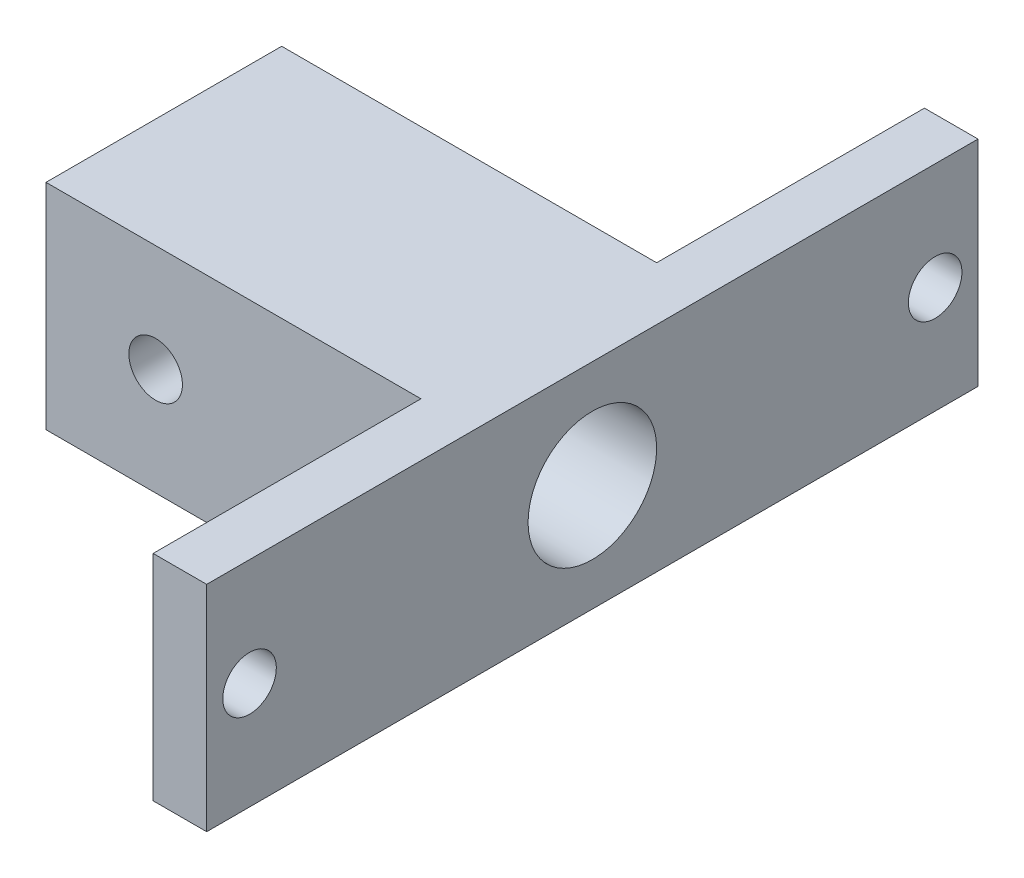
ISO-10303-21;
HEADER;
FILE_DESCRIPTION(('STEP AP214'),'2;1');
FILE_NAME('part.step','',(''),(''),'','','');
FILE_SCHEMA(('AUTOMOTIVE_DESIGN { 1 0 10303 214 1 1 1 1 }'));
ENDSEC;
DATA;
#1=APPLICATION_CONTEXT('core data for automotive mechanical design processes');
#2=APPLICATION_PROTOCOL_DEFINITION('international standard','automotive_design',2000,#1);
#3=PRODUCT_CONTEXT('',#1,'mechanical');
#4=PRODUCT('Part','Part','',(#3));
#5=PRODUCT_RELATED_PRODUCT_CATEGORY('part','',(#4));
#6=PRODUCT_DEFINITION_FORMATION('','',#4);
#7=PRODUCT_DEFINITION_CONTEXT('part definition',#1,'design');
#8=PRODUCT_DEFINITION('design','',#6,#7);
#9=PRODUCT_DEFINITION_SHAPE('','',#8);
#10=(LENGTH_UNIT() NAMED_UNIT(*) SI_UNIT(.MILLI.,.METRE.));
#11=(NAMED_UNIT(*) PLANE_ANGLE_UNIT() SI_UNIT($,.RADIAN.));
#12=(NAMED_UNIT(*) SI_UNIT($,.STERADIAN.) SOLID_ANGLE_UNIT());
#13=UNCERTAINTY_MEASURE_WITH_UNIT(LENGTH_MEASURE(1.E-05),#10,'distance_accuracy_value','');
#14=(GEOMETRIC_REPRESENTATION_CONTEXT(3) GLOBAL_UNCERTAINTY_ASSIGNED_CONTEXT((#13)) GLOBAL_UNIT_ASSIGNED_CONTEXT((#10,
#11,#12)) REPRESENTATION_CONTEXT('',''));
#15=CARTESIAN_POINT('',(0.,0.,0.));
#16=DIRECTION('',(0.,0.,1.));
#17=DIRECTION('',(1.,0.,0.));
#18=AXIS2_PLACEMENT_3D('',#15,#16,#17);
#19=CARTESIAN_POINT('',(0.,0.,-6.985));
#20=DIRECTION('',(0.,0.,1.));
#21=DIRECTION('',(1.,0.,0.));
#22=AXIS2_PLACEMENT_3D('',#19,#20,#21);
#23=PLANE('',#22);
#24=CARTESIAN_POINT('',(-6.20047096,0.,-6.985));
#25=DIRECTION('',(0.,0.,1.));
#26=DIRECTION('',(1.,0.,0.));
#27=AXIS2_PLACEMENT_3D('',#24,#25,#26);
#28=CIRCLE('',#27,1.5875);
#29=CARTESIAN_POINT('',(-4.61297096,0.,-6.985));
#30=VERTEX_POINT('',#29);
#31=EDGE_CURVE('E358',#30,#30,#28,.T.);
#32=ORIENTED_EDGE('',*,*,#31,.T.);
#33=EDGE_LOOP('',(#32));
#34=FACE_BOUND('',#33,.T.);
#35=DIRECTION('',(0.,1.,0.));
#36=VECTOR('',#35,1.);
#37=CARTESIAN_POINT('',(9.525,6.35,-6.985));
#38=LINE('',#37,#36);
#39=CARTESIAN_POINT('',(9.525,-6.35,-6.985));
#40=VERTEX_POINT('',#39);
#41=CARTESIAN_POINT('',(9.525,6.35,-6.985));
#42=VERTEX_POINT('',#41);
#43=EDGE_CURVE('E66',#40,#42,#38,.T.);
#44=ORIENTED_EDGE('',*,*,#43,.F.);
#45=DIRECTION('',(1.,0.,0.));
#46=VECTOR('',#45,1.);
#47=CARTESIAN_POINT('',(-12.7,-6.35,-6.985));
#48=LINE('',#47,#46);
#49=CARTESIAN_POINT('',(-12.7,-6.35,-6.985));
#50=VERTEX_POINT('',#49);
#51=EDGE_CURVE('E160',#50,#40,#48,.T.);
#52=ORIENTED_EDGE('',*,*,#51,.F.);
#53=DIRECTION('',(0.,-1.,0.));
#54=VECTOR('',#53,1.);
#55=CARTESIAN_POINT('',(-12.7,6.35,-6.985));
#56=LINE('',#55,#54);
#57=CARTESIAN_POINT('',(-12.7,6.35,-6.985));
#58=VERTEX_POINT('',#57);
#59=EDGE_CURVE('E166',#58,#50,#56,.T.);
#60=ORIENTED_EDGE('',*,*,#59,.F.);
#61=DIRECTION('',(-1.,0.,0.));
#62=VECTOR('',#61,1.);
#63=CARTESIAN_POINT('',(-12.7,6.35,-6.985));
#64=LINE('',#63,#62);
#65=EDGE_CURVE('E156',#42,#58,#64,.T.);
#66=ORIENTED_EDGE('',*,*,#65,.F.);
#67=EDGE_LOOP('',(#44,#52,#60,#66));
#68=FACE_BOUND('',#67,.T.);
#69=ADVANCED_FACE('F36',(#34,#68),#23,.F.);
#70=CARTESIAN_POINT('',(12.7,6.35,6.985));
#71=DIRECTION('',(-1.,0.,0.));
#72=DIRECTION('',(0.,0.,1.));
#73=AXIS2_PLACEMENT_3D('',#70,#71,#72);
#74=PLANE('',#73);
#75=CARTESIAN_POINT('',(12.7,0.,0.));
#76=DIRECTION('',(-1.,0.,0.));
#77=DIRECTION('',(0.,0.,1.));
#78=AXIS2_PLACEMENT_3D('',#75,#76,#77);
#79=CIRCLE('',#78,3.81);
#80=CARTESIAN_POINT('',(12.7,0.,3.81));
#81=VERTEX_POINT('',#80);
#82=EDGE_CURVE('E357',#81,#81,#79,.T.);
#83=ORIENTED_EDGE('',*,*,#82,.T.);
#84=EDGE_LOOP('',(#83));
#85=FACE_BOUND('',#84,.T.);
#86=CARTESIAN_POINT('',(12.7,0.,-20.32));
#87=DIRECTION('',(-1.,0.,0.));
#88=DIRECTION('',(0.,-1.,0.));
#89=AXIS2_PLACEMENT_3D('',#86,#87,#88);
#90=CIRCLE('',#89,1.5875);
#91=CARTESIAN_POINT('',(12.7,-1.5875,-20.32));
#92=VERTEX_POINT('',#91);
#93=EDGE_CURVE('E130',#92,#92,#90,.T.);
#94=ORIENTED_EDGE('',*,*,#93,.T.);
#95=EDGE_LOOP('',(#94));
#96=FACE_BOUND('',#95,.T.);
#97=CARTESIAN_POINT('',(12.7,0.,20.32));
#98=DIRECTION('',(-1.,0.,0.));
#99=DIRECTION('',(0.,-1.,0.));
#100=AXIS2_PLACEMENT_3D('',#97,#98,#99);
#101=CIRCLE('',#100,1.5875);
#102=CARTESIAN_POINT('',(12.7,-1.5875,20.32));
#103=VERTEX_POINT('',#102);
#104=EDGE_CURVE('E349',#103,#103,#101,.T.);
#105=ORIENTED_EDGE('',*,*,#104,.T.);
#106=EDGE_LOOP('',(#105));
#107=FACE_BOUND('',#106,.T.);
#108=DIRECTION('',(0.,0.,-1.));
#109=VECTOR('',#108,1.);
#110=CARTESIAN_POINT('',(12.7,-6.35,6.985));
#111=LINE('',#110,#109);
#112=CARTESIAN_POINT('',(12.7,-6.35,22.86));
#113=VERTEX_POINT('',#112);
#114=CARTESIAN_POINT('',(12.7,-6.35,-22.86));
#115=VERTEX_POINT('',#114);
#116=EDGE_CURVE('E164',#113,#115,#111,.T.);
#117=ORIENTED_EDGE('',*,*,#116,.T.);
#118=DIRECTION('',(0.,-1.,0.));
#119=VECTOR('',#118,1.);
#120=CARTESIAN_POINT('',(12.7,6.35,-22.86));
#121=LINE('',#120,#119);
#122=CARTESIAN_POINT('',(12.7,6.35,-22.86));
#123=VERTEX_POINT('',#122);
#124=EDGE_CURVE('E112',#123,#115,#121,.T.);
#125=ORIENTED_EDGE('',*,*,#124,.F.);
#126=DIRECTION('',(0.,0.,-1.));
#127=VECTOR('',#126,1.);
#128=CARTESIAN_POINT('',(12.7,6.35,6.985));
#129=LINE('',#128,#127);
#130=CARTESIAN_POINT('',(12.7,6.35,22.86));
#131=VERTEX_POINT('',#130);
#132=EDGE_CURVE('E11',#131,#123,#129,.T.);
#133=ORIENTED_EDGE('',*,*,#132,.F.);
#134=DIRECTION('',(0.,1.,0.));
#135=VECTOR('',#134,1.);
#136=CARTESIAN_POINT('',(12.7,-6.35,22.86));
#137=LINE('',#136,#135);
#138=EDGE_CURVE('E110',#113,#131,#137,.T.);
#139=ORIENTED_EDGE('',*,*,#138,.F.);
#140=EDGE_LOOP('',(#117,#125,#133,#139));
#141=FACE_BOUND('',#140,.T.);
#142=ADVANCED_FACE('F38',(#85,#96,#107,#141),#74,.F.);
#143=CARTESIAN_POINT('',(-12.7,6.35,6.985));
#144=DIRECTION('',(0.,-1.,0.));
#145=DIRECTION('',(0.,0.,-1.));
#146=AXIS2_PLACEMENT_3D('',#143,#144,#145);
#147=PLANE('',#146);
#148=ORIENTED_EDGE('',*,*,#132,.T.);
#149=DIRECTION('',(1.,0.,0.));
#150=VECTOR('',#149,1.);
#151=CARTESIAN_POINT('',(12.7,6.35,-22.86));
#152=LINE('',#151,#150);
#153=CARTESIAN_POINT('',(9.525,6.35,-22.86));
#154=VERTEX_POINT('',#153);
#155=EDGE_CURVE('E147',#154,#123,#152,.T.);
#156=ORIENTED_EDGE('',*,*,#155,.F.);
#157=DIRECTION('',(0.,0.,1.));
#158=VECTOR('',#157,1.);
#159=CARTESIAN_POINT('',(9.525,6.35,-22.86));
#160=LINE('',#159,#158);
#161=EDGE_CURVE('E149',#154,#42,#160,.T.);
#162=ORIENTED_EDGE('',*,*,#161,.T.);
#163=ORIENTED_EDGE('',*,*,#65,.T.);
#164=DIRECTION('',(0.,0.,-1.));
#165=VECTOR('',#164,1.);
#166=CARTESIAN_POINT('',(-12.7,6.35,6.985));
#167=LINE('',#166,#165);
#168=CARTESIAN_POINT('',(-12.7,6.35,6.985));
#169=VERTEX_POINT('',#168);
#170=EDGE_CURVE('E50',#169,#58,#167,.T.);
#171=ORIENTED_EDGE('',*,*,#170,.F.);
#172=DIRECTION('',(-1.,0.,0.));
#173=VECTOR('',#172,1.);
#174=CARTESIAN_POINT('',(-12.7,6.35,6.985));
#175=LINE('',#174,#173);
#176=CARTESIAN_POINT('',(9.525,6.35,6.985));
#177=VERTEX_POINT('',#176);
#178=EDGE_CURVE('E157',#177,#169,#175,.T.);
#179=ORIENTED_EDGE('',*,*,#178,.F.);
#180=DIRECTION('',(0.,0.,-1.));
#181=VECTOR('',#180,1.);
#182=CARTESIAN_POINT('',(9.525,6.35,22.86));
#183=LINE('',#182,#181);
#184=CARTESIAN_POINT('',(9.525,6.35,22.86));
#185=VERTEX_POINT('',#184);
#186=EDGE_CURVE('E120',#185,#177,#183,.T.);
#187=ORIENTED_EDGE('',*,*,#186,.F.);
#188=DIRECTION('',(-1.,0.,0.));
#189=VECTOR('',#188,1.);
#190=CARTESIAN_POINT('',(12.7,6.35,22.86));
#191=LINE('',#190,#189);
#192=EDGE_CURVE('E117',#131,#185,#191,.T.);
#193=ORIENTED_EDGE('',*,*,#192,.F.);
#194=EDGE_LOOP('',(#148,#156,#162,#163,#171,#179,#187,#193));
#195=FACE_BOUND('',#194,.T.);
#196=ADVANCED_FACE('F118',(#195),#147,.F.);
#197=CARTESIAN_POINT('',(-12.7,6.35,6.985));
#198=DIRECTION('',(1.,0.,0.));
#199=DIRECTION('',(0.,1.,0.));
#200=AXIS2_PLACEMENT_3D('',#197,#198,#199);
#201=PLANE('',#200);
#202=CARTESIAN_POINT('',(-12.7,0.,0.));
#203=DIRECTION('',(-1.,0.,0.));
#204=DIRECTION('',(0.,0.,1.));
#205=AXIS2_PLACEMENT_3D('',#202,#203,#204);
#206=CIRCLE('',#205,3.81);
#207=CARTESIAN_POINT('',(-12.7,0.,3.81));
#208=VERTEX_POINT('',#207);
#209=EDGE_CURVE('E354',#208,#208,#206,.T.);
#210=ORIENTED_EDGE('',*,*,#209,.F.);
#211=EDGE_LOOP('',(#210));
#212=FACE_BOUND('',#211,.T.);
#213=ORIENTED_EDGE('',*,*,#59,.T.);
#214=DIRECTION('',(0.,0.,-1.));
#215=VECTOR('',#214,1.);
#216=CARTESIAN_POINT('',(-12.7,-6.35,6.985));
#217=LINE('',#216,#215);
#218=CARTESIAN_POINT('',(-12.7,-6.35,6.985));
#219=VERTEX_POINT('',#218);
#220=EDGE_CURVE('E170',#219,#50,#217,.T.);
#221=ORIENTED_EDGE('',*,*,#220,.F.);
#222=DIRECTION('',(0.,-1.,0.));
#223=VECTOR('',#222,1.);
#224=CARTESIAN_POINT('',(-12.7,6.35,6.985));
#225=LINE('',#224,#223);
#226=EDGE_CURVE('E159',#169,#219,#225,.T.);
#227=ORIENTED_EDGE('',*,*,#226,.F.);
#228=ORIENTED_EDGE('',*,*,#170,.T.);
#229=EDGE_LOOP('',(#213,#221,#227,#228));
#230=FACE_BOUND('',#229,.T.);
#231=ADVANCED_FACE('F213',(#212,#230),#201,.F.);
#232=CARTESIAN_POINT('',(-12.7,-6.35,6.985));
#233=DIRECTION('',(0.,1.,0.));
#234=DIRECTION('',(0.,0.,1.));
#235=AXIS2_PLACEMENT_3D('',#232,#233,#234);
#236=PLANE('',#235);
#237=ORIENTED_EDGE('',*,*,#51,.T.);
#238=DIRECTION('',(0.,0.,1.));
#239=VECTOR('',#238,1.);
#240=CARTESIAN_POINT('',(9.525,-6.35,-22.86));
#241=LINE('',#240,#239);
#242=CARTESIAN_POINT('',(9.525,-6.35,-22.86));
#243=VERTEX_POINT('',#242);
#244=EDGE_CURVE('E153',#243,#40,#241,.T.);
#245=ORIENTED_EDGE('',*,*,#244,.F.);
#246=DIRECTION('',(-1.,0.,0.));
#247=VECTOR('',#246,1.);
#248=CARTESIAN_POINT('',(12.7,-6.35,-22.86));
#249=LINE('',#248,#247);
#250=EDGE_CURVE('E143',#115,#243,#249,.T.);
#251=ORIENTED_EDGE('',*,*,#250,.F.);
#252=ORIENTED_EDGE('',*,*,#116,.F.);
#253=DIRECTION('',(1.,0.,0.));
#254=VECTOR('',#253,1.);
#255=CARTESIAN_POINT('',(12.7,-6.35,22.86));
#256=LINE('',#255,#254);
#257=CARTESIAN_POINT('',(9.525,-6.35,22.86));
#258=VERTEX_POINT('',#257);
#259=EDGE_CURVE('E128',#258,#113,#256,.T.);
#260=ORIENTED_EDGE('',*,*,#259,.F.);
#261=DIRECTION('',(0.,0.,-1.));
#262=VECTOR('',#261,1.);
#263=CARTESIAN_POINT('',(9.525,-6.35,22.86));
#264=LINE('',#263,#262);
#265=CARTESIAN_POINT('',(9.525,-6.35,6.985));
#266=VERTEX_POINT('',#265);
#267=EDGE_CURVE('E137',#258,#266,#264,.T.);
#268=ORIENTED_EDGE('',*,*,#267,.T.);
#269=DIRECTION('',(1.,0.,0.));
#270=VECTOR('',#269,1.);
#271=CARTESIAN_POINT('',(-12.7,-6.35,6.985));
#272=LINE('',#271,#270);
#273=EDGE_CURVE('E162',#219,#266,#272,.T.);
#274=ORIENTED_EDGE('',*,*,#273,.F.);
#275=ORIENTED_EDGE('',*,*,#220,.T.);
#276=EDGE_LOOP('',(#237,#245,#251,#252,#260,#268,#274,#275));
#277=FACE_BOUND('',#276,.T.);
#278=ADVANCED_FACE('F210',(#277),#236,.F.);
#279=CARTESIAN_POINT('',(0.,0.,6.985));
#280=DIRECTION('',(0.,0.,1.));
#281=DIRECTION('',(1.,0.,0.));
#282=AXIS2_PLACEMENT_3D('',#279,#280,#281);
#283=PLANE('',#282);
#284=CARTESIAN_POINT('',(-6.20047096,0.,6.985));
#285=DIRECTION('',(0.,0.,1.));
#286=DIRECTION('',(1.,0.,0.));
#287=AXIS2_PLACEMENT_3D('',#284,#285,#286);
#288=CIRCLE('',#287,1.5875);
#289=CARTESIAN_POINT('',(-4.61297096,0.,6.985));
#290=VERTEX_POINT('',#289);
#291=EDGE_CURVE('E179',#290,#290,#288,.T.);
#292=ORIENTED_EDGE('',*,*,#291,.F.);
#293=EDGE_LOOP('',(#292));
#294=FACE_BOUND('',#293,.T.);
#295=DIRECTION('',(0.,-1.,0.));
#296=VECTOR('',#295,1.);
#297=CARTESIAN_POINT('',(9.525,-6.35,6.985));
#298=LINE('',#297,#296);
#299=EDGE_CURVE('E58',#177,#266,#298,.T.);
#300=ORIENTED_EDGE('',*,*,#299,.F.);
#301=ORIENTED_EDGE('',*,*,#178,.T.);
#302=ORIENTED_EDGE('',*,*,#226,.T.);
#303=ORIENTED_EDGE('',*,*,#273,.T.);
#304=EDGE_LOOP('',(#300,#301,#302,#303));
#305=FACE_BOUND('',#304,.T.);
#306=ADVANCED_FACE('F208',(#294,#305),#283,.T.);
#307=CARTESIAN_POINT('',(9.525,6.35,-22.86));
#308=DIRECTION('',(1.,0.,0.));
#309=DIRECTION('',(0.,1.,0.));
#310=AXIS2_PLACEMENT_3D('',#307,#308,#309);
#311=PLANE('',#310);
#312=CARTESIAN_POINT('',(9.525,0.,-20.32));
#313=DIRECTION('',(-1.,0.,0.));
#314=DIRECTION('',(0.,-1.,0.));
#315=AXIS2_PLACEMENT_3D('',#312,#313,#314);
#316=CIRCLE('',#315,1.5875);
#317=CARTESIAN_POINT('',(9.525,-1.5875,-20.32));
#318=VERTEX_POINT('',#317);
#319=EDGE_CURVE('E348',#318,#318,#316,.T.);
#320=ORIENTED_EDGE('',*,*,#319,.F.);
#321=EDGE_LOOP('',(#320));
#322=FACE_BOUND('',#321,.T.);
#323=ORIENTED_EDGE('',*,*,#43,.T.);
#324=ORIENTED_EDGE('',*,*,#161,.F.);
#325=DIRECTION('',(0.,1.,0.));
#326=VECTOR('',#325,1.);
#327=CARTESIAN_POINT('',(9.525,6.35,-22.86));
#328=LINE('',#327,#326);
#329=EDGE_CURVE('E145',#243,#154,#328,.T.);
#330=ORIENTED_EDGE('',*,*,#329,.F.);
#331=ORIENTED_EDGE('',*,*,#244,.T.);
#332=EDGE_LOOP('',(#323,#324,#330,#331));
#333=FACE_BOUND('',#332,.T.);
#334=ADVANCED_FACE('F238',(#322,#333),#311,.F.);
#335=CARTESIAN_POINT('',(0.,0.,-22.86));
#336=DIRECTION('',(0.,0.,-1.));
#337=DIRECTION('',(-1.,0.,0.));
#338=AXIS2_PLACEMENT_3D('',#335,#336,#337);
#339=PLANE('',#338);
#340=ORIENTED_EDGE('',*,*,#124,.T.);
#341=ORIENTED_EDGE('',*,*,#250,.T.);
#342=ORIENTED_EDGE('',*,*,#329,.T.);
#343=ORIENTED_EDGE('',*,*,#155,.T.);
#344=EDGE_LOOP('',(#340,#341,#342,#343));
#345=FACE_BOUND('',#344,.T.);
#346=ADVANCED_FACE('F246',(#345),#339,.T.);
#347=CARTESIAN_POINT('',(9.525,-6.35,22.86));
#348=DIRECTION('',(1.,0.,0.));
#349=DIRECTION('',(0.,0.,-1.));
#350=AXIS2_PLACEMENT_3D('',#347,#348,#349);
#351=PLANE('',#350);
#352=CARTESIAN_POINT('',(9.525,0.,20.32));
#353=DIRECTION('',(-1.,0.,0.));
#354=DIRECTION('',(0.,-1.,0.));
#355=AXIS2_PLACEMENT_3D('',#352,#353,#354);
#356=CIRCLE('',#355,1.5875);
#357=CARTESIAN_POINT('',(9.525,-1.5875,20.32));
#358=VERTEX_POINT('',#357);
#359=EDGE_CURVE('E133',#358,#358,#356,.T.);
#360=ORIENTED_EDGE('',*,*,#359,.F.);
#361=EDGE_LOOP('',(#360));
#362=FACE_BOUND('',#361,.T.);
#363=ORIENTED_EDGE('',*,*,#299,.T.);
#364=ORIENTED_EDGE('',*,*,#267,.F.);
#365=DIRECTION('',(0.,-1.,0.));
#366=VECTOR('',#365,1.);
#367=CARTESIAN_POINT('',(9.525,-6.35,22.86));
#368=LINE('',#367,#366);
#369=EDGE_CURVE('E123',#185,#258,#368,.T.);
#370=ORIENTED_EDGE('',*,*,#369,.F.);
#371=ORIENTED_EDGE('',*,*,#186,.T.);
#372=EDGE_LOOP('',(#363,#364,#370,#371));
#373=FACE_BOUND('',#372,.T.);
#374=ADVANCED_FACE('F253',(#362,#373),#351,.F.);
#375=CARTESIAN_POINT('',(0.,0.,22.86));
#376=DIRECTION('',(0.,0.,1.));
#377=DIRECTION('',(1.,0.,0.));
#378=AXIS2_PLACEMENT_3D('',#375,#376,#377);
#379=PLANE('',#378);
#380=ORIENTED_EDGE('',*,*,#138,.T.);
#381=ORIENTED_EDGE('',*,*,#192,.T.);
#382=ORIENTED_EDGE('',*,*,#369,.T.);
#383=ORIENTED_EDGE('',*,*,#259,.T.);
#384=EDGE_LOOP('',(#380,#381,#382,#383));
#385=FACE_BOUND('',#384,.T.);
#386=ADVANCED_FACE('F126',(#385),#379,.T.);
#387=CARTESIAN_POINT('',(12.7,0.,20.32));
#388=DIRECTION('',(-1.,0.,0.));
#389=DIRECTION('',(0.,-1.,0.));
#390=AXIS2_PLACEMENT_3D('',#387,#388,#389);
#391=CYLINDRICAL_SURFACE('',#390,1.5875);
#392=ORIENTED_EDGE('',*,*,#104,.F.);
#393=EDGE_LOOP('',(#392));
#394=FACE_BOUND('',#393,.T.);
#395=ORIENTED_EDGE('',*,*,#359,.T.);
#396=EDGE_LOOP('',(#395));
#397=FACE_BOUND('',#396,.T.);
#398=ADVANCED_FACE('F267',(#394,#397),#391,.F.);
#399=CARTESIAN_POINT('',(12.7,0.,-20.32));
#400=DIRECTION('',(-1.,0.,0.));
#401=DIRECTION('',(0.,-1.,0.));
#402=AXIS2_PLACEMENT_3D('',#399,#400,#401);
#403=CYLINDRICAL_SURFACE('',#402,1.5875);
#404=ORIENTED_EDGE('',*,*,#93,.F.);
#405=EDGE_LOOP('',(#404));
#406=FACE_BOUND('',#405,.T.);
#407=ORIENTED_EDGE('',*,*,#319,.T.);
#408=EDGE_LOOP('',(#407));
#409=FACE_BOUND('',#408,.T.);
#410=ADVANCED_FACE('F194',(#406,#409),#403,.F.);
#411=CARTESIAN_POINT('',(12.7,0.,0.));
#412=DIRECTION('',(-1.,0.,0.));
#413=DIRECTION('',(0.,0.,1.));
#414=AXIS2_PLACEMENT_3D('',#411,#412,#413);
#415=CYLINDRICAL_SURFACE('',#414,3.81);
#416=CARTESIAN_POINT('',(-4.61297096,0.,3.81));
#417=CARTESIAN_POINT('',(-4.61298011046594,0.0850367268480578,3.80999312126436));
#418=CARTESIAN_POINT('',(-4.61984414733073,0.170207174271077,3.80712005877882));
#419=CARTESIAN_POINT('',(-4.64705657244863,0.33813416136856,3.7959049504603));
#420=CARTESIAN_POINT('',(-4.66744014806959,0.420883812057926,3.78754863394305));
#421=CARTESIAN_POINT('',(-4.72080804656135,0.581264691739421,3.76626487078421));
#422=CARTESIAN_POINT('',(-4.75374968462455,0.658912226021361,3.75335291968255));
#423=CARTESIAN_POINT('',(-4.83112244550536,0.807503790983348,3.72421513817743));
#424=CARTESIAN_POINT('',(-4.875550088093,0.878449843320243,3.70799031187918));
#425=CARTESIAN_POINT('',(-4.97698976789041,1.01529947252058,3.67293942006873));
#426=CARTESIAN_POINT('',(-5.03448562216298,1.08082240974757,3.65402816724138));
#427=CARTESIAN_POINT('',(-5.15940666517386,1.2016229727859,3.61610546867012));
#428=CARTESIAN_POINT('',(-5.22683704861602,1.25689520420442,3.59709397555648));
#429=CARTESIAN_POINT('',(-5.37373496750741,1.35831246875273,3.56007697702504));
#430=CARTESIAN_POINT('',(-5.45363151950171,1.40387461355485,3.54216699329198));
#431=CARTESIAN_POINT('',(-5.62080899755958,1.4807430454786,3.51073176893396));
#432=CARTESIAN_POINT('',(-5.70808609194525,1.51205667662089,3.49720427051046));
#433=CARTESIAN_POINT('',(-5.88316614854526,1.55796739856442,3.47698765342385));
#434=CARTESIAN_POINT('',(-5.97074127390803,1.57329705504559,3.47000052317769));
#435=CARTESIAN_POINT('',(-6.14747804171194,1.58909016659102,3.4627988429877));
#436=CARTESIAN_POINT('',(-6.23663878203269,1.58956182029085,3.4625805580008));
#437=CARTESIAN_POINT('',(-6.40671903675237,1.57617731961866,3.46868901842283));
#438=CARTESIAN_POINT('',(-6.48774635263687,1.56341675012622,3.47451531059001));
#439=CARTESIAN_POINT('',(-6.64638331557049,1.52576772590036,3.49121073122721));
#440=CARTESIAN_POINT('',(-6.72399230499455,1.50087694854715,3.50208082543526));
#441=CARTESIAN_POINT('',(-6.87554924279913,1.43918887584015,3.527884546614));
#442=CARTESIAN_POINT('',(-6.94938414455999,1.4021494885483,3.54289972075403));
#443=CARTESIAN_POINT('',(-7.09007768202778,1.31738678077314,3.57528280549179));
#444=CARTESIAN_POINT('',(-7.15693355127916,1.26965924695982,3.5926516428482));
#445=CARTESIAN_POINT('',(-7.2877179075907,1.16013987624067,3.62957080635034));
#446=CARTESIAN_POINT('',(-7.3509215005795,1.09750032367356,3.6491814418368));
#447=CARTESIAN_POINT('',(-7.46617010875816,0.962316580635423,3.68713604852912));
#448=CARTESIAN_POINT('',(-7.51821251004907,0.889770076499543,3.70547972233802));
#449=CARTESIAN_POINT('',(-7.61072445599266,0.734628894840591,3.7393662011672));
#450=CARTESIAN_POINT('',(-7.65089915534137,0.651840939708557,3.75483458510034));
#451=CARTESIAN_POINT('',(-7.71649680729614,0.47987255120908,3.780656413968));
#452=CARTESIAN_POINT('',(-7.74192791256865,0.390695681389697,3.79101268524166));
#453=CARTESIAN_POINT('',(-7.77579927000083,0.214538703949712,3.80491544306709));
#454=CARTESIAN_POINT('',(-7.78521233895356,0.127776332303874,3.80885117129849));
#455=CARTESIAN_POINT('',(-7.7896806639899,-0.0461704124800311,3.81071183968306));
#456=CARTESIAN_POINT('',(-7.78474004222004,-0.133354657283845,3.80863850554162));
#457=CARTESIAN_POINT('',(-7.7613376822963,-0.301114767773621,3.79896646424314));
#458=CARTESIAN_POINT('',(-7.74355911829656,-0.381803867632019,3.79164706850667));
#459=CARTESIAN_POINT('',(-7.69593635293321,-0.538966091193284,3.77251730600966));
#460=CARTESIAN_POINT('',(-7.66609062724312,-0.615438680878317,3.76070637188824));
#461=CARTESIAN_POINT('',(-7.59420582084561,-0.764678429833802,3.7332700371936));
#462=CARTESIAN_POINT('',(-7.55181676740454,-0.837256690806261,3.71753754165987));
#463=CARTESIAN_POINT('',(-7.45643317020455,-0.974529694613915,3.68393731815445));
#464=CARTESIAN_POINT('',(-7.40343419855782,-1.03922112780446,3.66606869996291));
#465=CARTESIAN_POINT('',(-7.28390385374404,-1.16374345644831,3.62854351627206));
#466=CARTESIAN_POINT('',(-7.21667606120745,-1.22289658643439,3.60885043520607));
#467=CARTESIAN_POINT('',(-7.07293393956205,-1.329270704554,3.57104107695367));
#468=CARTESIAN_POINT('',(-6.9964175073319,-1.37648898292734,3.55292515846667));
#469=CARTESIAN_POINT('',(-6.83469095736573,-1.45816269465048,3.52020360529865));
#470=CARTESIAN_POINT('',(-6.74937253489617,-1.49242676161408,3.50565164444992));
#471=CARTESIAN_POINT('',(-6.57338030586117,-1.54581115718498,3.48244611686875));
#472=CARTESIAN_POINT('',(-6.48271098164615,-1.56494397276883,3.47378768735805));
#473=CARTESIAN_POINT('',(-6.306111212017,-1.58628182043104,3.46409218962325));
#474=CARTESIAN_POINT('',(-6.22035323888838,-1.58967653124674,3.46251975728297));
#475=CARTESIAN_POINT('',(-6.0495405263508,-1.58261780915369,3.46575193324));
#476=CARTESIAN_POINT('',(-5.96448568100161,-1.57216650215196,3.47055556256189));
#477=CARTESIAN_POINT('',(-5.80157317071451,-1.53871174071224,3.4855093015388));
#478=CARTESIAN_POINT('',(-5.72356478470149,-1.51631527535762,3.4954001065503));
#479=CARTESIAN_POINT('',(-5.57239497287632,-1.46019936816711,3.5192104012297));
#480=CARTESIAN_POINT('',(-5.49923491594355,-1.4264767446691,3.5331310227725));
#481=CARTESIAN_POINT('',(-5.35503717214461,-1.34633063138072,3.56447032291217));
#482=CARTESIAN_POINT('',(-5.28439160068627,-1.29926538356314,3.58204900446373));
#483=CARTESIAN_POINT('',(-5.15162858301194,-1.1946687722406,3.61827685098376));
#484=CARTESIAN_POINT('',(-5.08951410698727,-1.13713377971014,3.63692638559261));
#485=CARTESIAN_POINT('',(-4.97092213426037,-1.0082555981391,3.67482618919635));
#486=CARTESIAN_POINT('',(-4.91518469029237,-0.936211919735267,3.69402128239975));
#487=CARTESIAN_POINT('',(-4.81655265399959,-0.783082100651564,3.72948382399965));
#488=CARTESIAN_POINT('',(-4.77366391409026,-0.701991862391099,3.7457499369426));
#489=CARTESIAN_POINT('',(-4.70287445629134,-0.534329712031799,3.77328662870325));
#490=CARTESIAN_POINT('',(-4.67473770639603,-0.44787056854541,3.78463533879094));
#491=CARTESIAN_POINT('',(-4.63366392207115,-0.271031235745132,3.80137682406153));
#492=CARTESIAN_POINT('',(-4.62067929798705,-0.180664252565818,3.80678824381198));
#493=CARTESIAN_POINT('',(-4.61381784542021,-0.0599898240373643,3.80964805212546));
#494=CARTESIAN_POINT('',(-4.61296773147048,-0.0300032352380858,3.8100024270022));
#495=CARTESIAN_POINT('',(-4.61297096,0.,3.81));
#496=B_SPLINE_CURVE_WITH_KNOTS('',3,(#416,#417,#418,#419,#420,#421,#422,#423,#424,#425,#426,
#427,#428,#429,#430,#431,#432,#433,#434,#435,#436,#437,#438,#439,#440,#441,#442,#443,#444,#445,
#446,#447,#448,#449,#450,#451,#452,#453,#454,#455,#456,#457,#458,#459,#460,#461,#462,#463,#464,
#465,#466,#467,#468,#469,#470,#471,#472,#473,#474,#475,#476,#477,#478,#479,#480,#481,#482,#483,
#484,#485,#486,#487,#488,#489,#490,#491,#492,#493,#494,#495),.UNSPECIFIED.,.T.,.F.,(4,2,2,2,2,2,
2,2,2,2,2,2,2,2,2,2,2,2,2,2,2,2,2,2,2,2,2,2,2,2,2,2,2,2,2,2,2,2,2,4),(0.,0.255024786982602,
0.510715946598445,0.765545651921003,1.02029823480328,1.28673779086785,1.55331716426961,
1.83301290164689,2.11256431347847,2.37864996884698,2.64458879576289,2.89014099647247,
3.1357402325356,3.38656565584568,3.63749013060852,3.90962059232429,4.18181471629527,
4.46029149927233,4.73861414757237,4.99933523109429,5.25998144716329,5.50769268964366,
5.75543523284267,6.01087361795645,6.2664188294626,6.54022679797204,6.81409687775234,
7.09186781216595,7.36940927784718,7.62558644500748,7.88172428347872,8.12593815455249,
8.37022068587279,8.62919144614751,8.88825214250949,9.1661809945621,9.444236247743,
9.7176952689062,9.99029308096039,10.0802726575386),.UNSPECIFIED.);
#497=CARTESIAN_POINT('',(-4.61297096,0.,3.81));
#498=VERTEX_POINT('',#497);
#499=EDGE_CURVE('E40',#498,#498,#496,.T.);
#500=ORIENTED_EDGE('',*,*,#499,.T.);
#501=EDGE_LOOP('',(#500));
#502=FACE_BOUND('',#501,.T.);
#503=CARTESIAN_POINT('',(-4.61297096,0.,-3.81));
#504=CARTESIAN_POINT('',(-4.61298011046595,-0.085036726848059,-3.80999312126436));
#505=CARTESIAN_POINT('',(-4.61984414733073,-0.170207174271078,-3.80712005877882));
#506=CARTESIAN_POINT('',(-4.64705657244862,-0.338134161368561,-3.7959049504603));
#507=CARTESIAN_POINT('',(-4.66744014806959,-0.420883812057927,-3.78754863394305));
#508=CARTESIAN_POINT('',(-4.72080804656135,-0.581264691739422,-3.76626487078421));
#509=CARTESIAN_POINT('',(-4.75374968462455,-0.658912226021362,-3.75335291968255));
#510=CARTESIAN_POINT('',(-4.83112244550536,-0.807503790983349,-3.72421513817743));
#511=CARTESIAN_POINT('',(-4.875550088093,-0.878449843320244,-3.70799031187918));
#512=CARTESIAN_POINT('',(-4.97698976789042,-1.01529947252058,-3.67293942006873));
#513=CARTESIAN_POINT('',(-5.03448562216298,-1.08082240974757,-3.65402816724138));
#514=CARTESIAN_POINT('',(-5.15940666517386,-1.2016229727859,-3.61610546867012));
#515=CARTESIAN_POINT('',(-5.22683704861602,-1.25689520420442,-3.59709397555648));
#516=CARTESIAN_POINT('',(-5.37373496750741,-1.35831246875273,-3.56007697702504));
#517=CARTESIAN_POINT('',(-5.45363151950171,-1.40387461355485,-3.54216699329199));
#518=CARTESIAN_POINT('',(-5.62080899755958,-1.4807430454786,-3.51073176893396));
#519=CARTESIAN_POINT('',(-5.70808609194525,-1.51205667662089,-3.49720427051046));
#520=CARTESIAN_POINT('',(-5.88316614854526,-1.55796739856442,-3.47698765342385));
#521=CARTESIAN_POINT('',(-5.97074127390803,-1.57329705504559,-3.47000052317769));
#522=CARTESIAN_POINT('',(-6.14747804171194,-1.58909016659102,-3.4627988429877));
#523=CARTESIAN_POINT('',(-6.23663878203269,-1.58956182029085,-3.4625805580008));
#524=CARTESIAN_POINT('',(-6.40671903675237,-1.57617731961866,-3.46868901842283));
#525=CARTESIAN_POINT('',(-6.48774635263687,-1.56341675012622,-3.47451531059001));
#526=CARTESIAN_POINT('',(-6.64638331557049,-1.52576772590036,-3.49121073122721));
#527=CARTESIAN_POINT('',(-6.72399230499455,-1.50087694854715,-3.50208082543526));
#528=CARTESIAN_POINT('',(-6.87554924279913,-1.43918887584015,-3.52788454661401));
#529=CARTESIAN_POINT('',(-6.94938414455999,-1.4021494885483,-3.54289972075403));
#530=CARTESIAN_POINT('',(-7.09007768202779,-1.31738678077314,-3.57528280549179));
#531=CARTESIAN_POINT('',(-7.15693355127917,-1.26965924695982,-3.5926516428482));
#532=CARTESIAN_POINT('',(-7.2877179075907,-1.16013987624067,-3.62957080635034));
#533=CARTESIAN_POINT('',(-7.3509215005795,-1.09750032367356,-3.6491814418368));
#534=CARTESIAN_POINT('',(-7.46617010875816,-0.962316580635422,-3.68713604852912));
#535=CARTESIAN_POINT('',(-7.51821251004907,-0.889770076499542,-3.70547972233802));
#536=CARTESIAN_POINT('',(-7.61072445599266,-0.73462889484059,-3.73936620116721));
#537=CARTESIAN_POINT('',(-7.65089915534137,-0.651840939708556,-3.75483458510034));
#538=CARTESIAN_POINT('',(-7.71649680729614,-0.479872551209078,-3.780656413968));
#539=CARTESIAN_POINT('',(-7.74192791256865,-0.390695681389696,-3.79101268524166));
#540=CARTESIAN_POINT('',(-7.77579927000083,-0.214538703949712,-3.80491544306709));
#541=CARTESIAN_POINT('',(-7.78521233895356,-0.127776332303874,-3.80885117129849));
#542=CARTESIAN_POINT('',(-7.7896806639899,0.0461704124800315,-3.81071183968306));
#543=CARTESIAN_POINT('',(-7.78474004222004,0.133354657283846,-3.80863850554162));
#544=CARTESIAN_POINT('',(-7.7613376822963,0.301114767773622,-3.79896646424314));
#545=CARTESIAN_POINT('',(-7.74355911829656,0.38180386763202,-3.79164706850667));
#546=CARTESIAN_POINT('',(-7.69593635293321,0.538966091193284,-3.77251730600966));
#547=CARTESIAN_POINT('',(-7.66609062724312,0.615438680878318,-3.76070637188824));
#548=CARTESIAN_POINT('',(-7.59420582084561,0.764678429833802,-3.7332700371936));
#549=CARTESIAN_POINT('',(-7.55181676740454,0.837256690806261,-3.71753754165987));
#550=CARTESIAN_POINT('',(-7.45643317020455,0.974529694613914,-3.68393731815445));
#551=CARTESIAN_POINT('',(-7.40343419855782,1.03922112780446,-3.66606869996291));
#552=CARTESIAN_POINT('',(-7.28390385374404,1.16374345644832,-3.62854351627206));
#553=CARTESIAN_POINT('',(-7.21667606120745,1.22289658643439,-3.60885043520607));
#554=CARTESIAN_POINT('',(-7.07293393956205,1.329270704554,-3.57104107695366));
#555=CARTESIAN_POINT('',(-6.9964175073319,1.37648898292734,-3.55292515846667));
#556=CARTESIAN_POINT('',(-6.83469095736573,1.45816269465048,-3.52020360529865));
#557=CARTESIAN_POINT('',(-6.74937253489617,1.49242676161408,-3.50565164444991));
#558=CARTESIAN_POINT('',(-6.57338030586117,1.54581115718498,-3.48244611686875));
#559=CARTESIAN_POINT('',(-6.48271098164615,1.56494397276883,-3.47378768735805));
#560=CARTESIAN_POINT('',(-6.306111212017,1.58628182043104,-3.46409218962325));
#561=CARTESIAN_POINT('',(-6.22035323888838,1.58967653124674,-3.46251975728296));
#562=CARTESIAN_POINT('',(-6.0495405263508,1.58261780915369,-3.46575193324));
#563=CARTESIAN_POINT('',(-5.96448568100161,1.57216650215196,-3.47055556256189));
#564=CARTESIAN_POINT('',(-5.80157317071451,1.53871174071224,-3.4855093015388));
#565=CARTESIAN_POINT('',(-5.72356478470149,1.51631527535762,-3.4954001065503));
#566=CARTESIAN_POINT('',(-5.57239497287632,1.46019936816711,-3.5192104012297));
#567=CARTESIAN_POINT('',(-5.49923491594355,1.4264767446691,-3.5331310227725));
#568=CARTESIAN_POINT('',(-5.35503717214461,1.34633063138072,-3.56447032291216));
#569=CARTESIAN_POINT('',(-5.28439160068627,1.29926538356314,-3.58204900446373));
#570=CARTESIAN_POINT('',(-5.15162858301194,1.1946687722406,-3.61827685098376));
#571=CARTESIAN_POINT('',(-5.08951410698727,1.13713377971014,-3.63692638559261));
#572=CARTESIAN_POINT('',(-4.97092213426037,1.0082555981391,-3.67482618919635));
#573=CARTESIAN_POINT('',(-4.91518469029237,0.936211919735267,-3.69402128239975));
#574=CARTESIAN_POINT('',(-4.81655265399959,0.783082100651564,-3.72948382399965));
#575=CARTESIAN_POINT('',(-4.77366391409026,0.701991862391099,-3.7457499369426));
#576=CARTESIAN_POINT('',(-4.70287445629134,0.534329712031798,-3.77328662870325));
#577=CARTESIAN_POINT('',(-4.67473770639603,0.447870568545409,-3.78463533879094));
#578=CARTESIAN_POINT('',(-4.63366392207115,0.271031235745131,-3.80137682406153));
#579=CARTESIAN_POINT('',(-4.62067929798704,0.180664252565817,-3.80678824381198));
#580=CARTESIAN_POINT('',(-4.61381784542021,0.0599898240373636,-3.80964805212546));
#581=CARTESIAN_POINT('',(-4.61296773147048,0.0300032352380849,-3.8100024270022));
#582=CARTESIAN_POINT('',(-4.61297096,0.,-3.81));
#583=B_SPLINE_CURVE_WITH_KNOTS('',3,(#503,#504,#505,#506,#507,#508,#509,#510,#511,#512,#513,
#514,#515,#516,#517,#518,#519,#520,#521,#522,#523,#524,#525,#526,#527,#528,#529,#530,#531,#532,
#533,#534,#535,#536,#537,#538,#539,#540,#541,#542,#543,#544,#545,#546,#547,#548,#549,#550,#551,
#552,#553,#554,#555,#556,#557,#558,#559,#560,#561,#562,#563,#564,#565,#566,#567,#568,#569,#570,
#571,#572,#573,#574,#575,#576,#577,#578,#579,#580,#581,#582),.UNSPECIFIED.,.T.,.F.,(4,2,2,2,2,2,
2,2,2,2,2,2,2,2,2,2,2,2,2,2,2,2,2,2,2,2,2,2,2,2,2,2,2,2,2,2,2,2,2,4),(0.,0.255024786982602,
0.510715946598445,0.765545651921003,1.02029823480328,1.28673779086785,1.55331716426961,
1.83301290164689,2.11256431347847,2.37864996884698,2.64458879576289,2.89014099647247,
3.1357402325356,3.38656565584568,3.63749013060852,3.90962059232429,4.18181471629527,
4.46029149927233,4.73861414757237,4.99933523109429,5.25998144716329,5.50769268964367,
5.75543523284267,6.01087361795645,6.2664188294626,6.54022679797204,6.81409687775234,
7.09186781216595,7.36940927784718,7.62558644500748,7.88172428347872,8.12593815455249,
8.37022068587279,8.62919144614751,8.8882521425095,9.1661809945621,9.44423624774301,
9.7176952689062,9.99029308096039,10.0802726575386),.UNSPECIFIED.);
#584=CARTESIAN_POINT('',(-4.61297096,0.,-3.81));
#585=VERTEX_POINT('',#584);
#586=EDGE_CURVE('E174',#585,#585,#583,.T.);
#587=ORIENTED_EDGE('',*,*,#586,.T.);
#588=EDGE_LOOP('',(#587));
#589=FACE_BOUND('',#588,.T.);
#590=ORIENTED_EDGE('',*,*,#82,.F.);
#591=EDGE_LOOP('',(#590));
#592=FACE_BOUND('',#591,.T.);
#593=ORIENTED_EDGE('',*,*,#209,.T.);
#594=EDGE_LOOP('',(#593));
#595=FACE_BOUND('',#594,.T.);
#596=ADVANCED_FACE('F180',(#502,#589,#592,#595),#415,.F.);
#597=CARTESIAN_POINT('',(-6.20047096,0.,-22.86));
#598=DIRECTION('',(0.,0.,1.));
#599=DIRECTION('',(1.,0.,0.));
#600=AXIS2_PLACEMENT_3D('',#597,#598,#599);
#601=CYLINDRICAL_SURFACE('',#600,1.5875);
#602=ORIENTED_EDGE('',*,*,#586,.F.);
#603=EDGE_LOOP('',(#602));
#604=FACE_BOUND('',#603,.T.);
#605=ORIENTED_EDGE('',*,*,#31,.F.);
#606=EDGE_LOOP('',(#605));
#607=FACE_BOUND('',#606,.T.);
#608=ADVANCED_FACE('F183',(#604,#607),#601,.F.);
#609=ORIENTED_EDGE('',*,*,#291,.T.);
#610=EDGE_LOOP('',(#609));
#611=FACE_BOUND('',#610,.T.);
#612=ORIENTED_EDGE('',*,*,#499,.F.);
#613=EDGE_LOOP('',(#612));
#614=FACE_BOUND('',#613,.T.);
#615=ADVANCED_FACE('F186',(#611,#614),#601,.F.);
#616=CLOSED_SHELL('',(#69,#142,#196,#231,#278,#306,#334,#346,#374,#386,#398,#410,#596,#608,#615));
#617=MANIFOLD_SOLID_BREP('B2',#616);
#618=ADVANCED_BREP_SHAPE_REPRESENTATION('',(#18,#617),#14);
#619=SHAPE_DEFINITION_REPRESENTATION(#9,#618);
ENDSEC;
END-ISO-10303-21;
